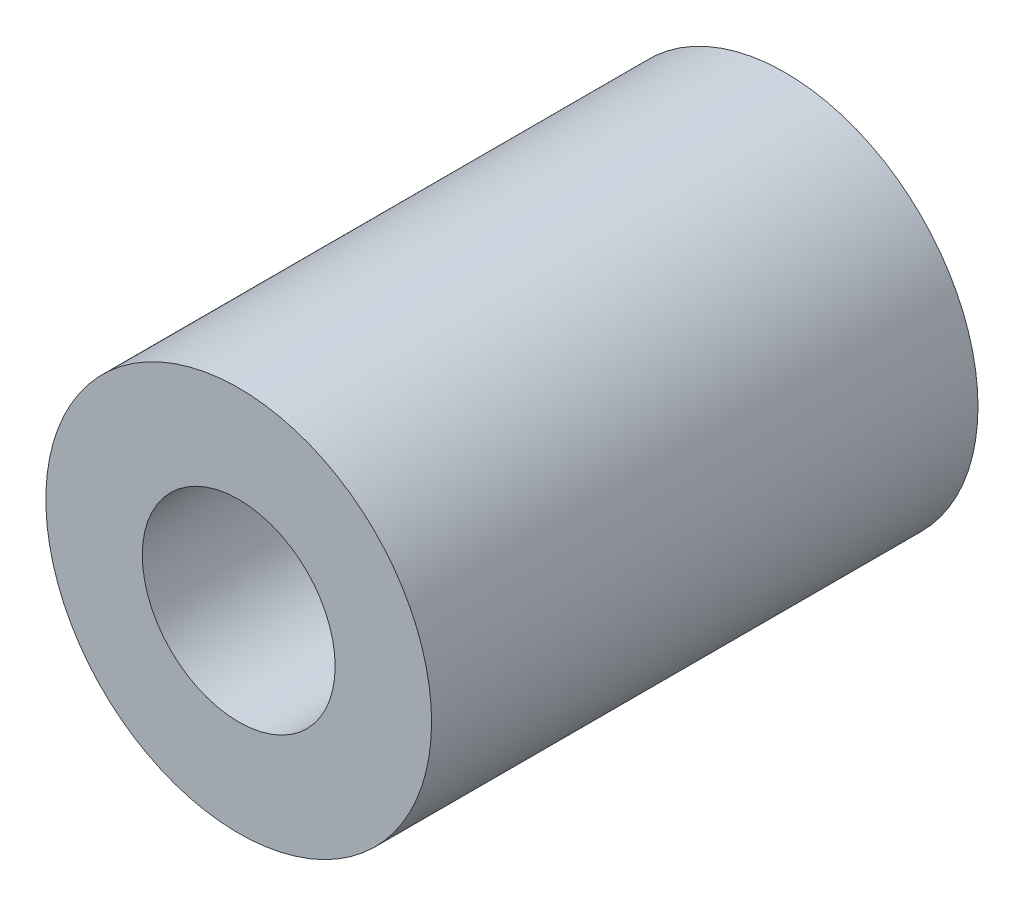
ISO-10303-21;
HEADER;
FILE_DESCRIPTION(('STEP AP214'),'2;1');
FILE_NAME('part.step','',(''),(''),'','','');
FILE_SCHEMA(('AUTOMOTIVE_DESIGN { 1 0 10303 214 1 1 1 1 }'));
ENDSEC;
DATA;
#1=APPLICATION_CONTEXT('core data for automotive mechanical design processes');
#2=APPLICATION_PROTOCOL_DEFINITION('international standard','automotive_design',2000,#1);
#3=PRODUCT_CONTEXT('',#1,'mechanical');
#4=PRODUCT('Part','Part','',(#3));
#5=PRODUCT_RELATED_PRODUCT_CATEGORY('part','',(#4));
#6=PRODUCT_DEFINITION_FORMATION('','',#4);
#7=PRODUCT_DEFINITION_CONTEXT('part definition',#1,'design');
#8=PRODUCT_DEFINITION('design','',#6,#7);
#9=PRODUCT_DEFINITION_SHAPE('','',#8);
#10=(LENGTH_UNIT() NAMED_UNIT(*) SI_UNIT(.MILLI.,.METRE.));
#11=(NAMED_UNIT(*) PLANE_ANGLE_UNIT() SI_UNIT($,.RADIAN.));
#12=(NAMED_UNIT(*) SI_UNIT($,.STERADIAN.) SOLID_ANGLE_UNIT());
#13=UNCERTAINTY_MEASURE_WITH_UNIT(LENGTH_MEASURE(1.E-05),#10,'distance_accuracy_value','');
#14=(GEOMETRIC_REPRESENTATION_CONTEXT(3) GLOBAL_UNCERTAINTY_ASSIGNED_CONTEXT((#13)) GLOBAL_UNIT_ASSIGNED_CONTEXT((#10,
#11,#12)) REPRESENTATION_CONTEXT('',''));
#15=CARTESIAN_POINT('',(0.,0.,0.));
#16=DIRECTION('',(0.,0.,1.));
#17=DIRECTION('',(1.,0.,0.));
#18=AXIS2_PLACEMENT_3D('',#15,#16,#17);
#19=CARTESIAN_POINT('',(0.,0.,17.));
#20=DIRECTION('',(0.,0.,1.));
#21=DIRECTION('',(1.,0.,0.));
#22=AXIS2_PLACEMENT_3D('',#19,#20,#21);
#23=PLANE('',#22);
#24=CARTESIAN_POINT('',(0.,0.,17.));
#25=DIRECTION('',(0.,0.,1.));
#26=DIRECTION('',(1.,0.,0.));
#27=AXIS2_PLACEMENT_3D('',#24,#25,#26);
#28=CIRCLE('',#27,6.);
#29=CARTESIAN_POINT('',(6.,0.,17.));
#30=VERTEX_POINT('',#29);
#31=EDGE_CURVE('E10',#30,#30,#28,.T.);
#32=ORIENTED_EDGE('',*,*,#31,.T.);
#33=EDGE_LOOP('',(#32));
#34=FACE_BOUND('',#33,.T.);
#35=CARTESIAN_POINT('',(0.,0.,17.));
#36=DIRECTION('',(0.,0.,1.));
#37=DIRECTION('',(1.,0.,0.));
#38=AXIS2_PLACEMENT_3D('',#35,#36,#37);
#39=CIRCLE('',#38,3.);
#40=CARTESIAN_POINT('',(3.,0.,17.));
#41=VERTEX_POINT('',#40);
#42=EDGE_CURVE('E41',#41,#41,#39,.T.);
#43=ORIENTED_EDGE('',*,*,#42,.F.);
#44=EDGE_LOOP('',(#43));
#45=FACE_BOUND('',#44,.T.);
#46=ADVANCED_FACE('F30',(#34,#45),#23,.T.);
#47=CARTESIAN_POINT('',(0.,0.,0.));
#48=DIRECTION('',(0.,0.,1.));
#49=DIRECTION('',(1.,0.,0.));
#50=AXIS2_PLACEMENT_3D('',#47,#48,#49);
#51=PLANE('',#50);
#52=CARTESIAN_POINT('',(0.,0.,0.));
#53=DIRECTION('',(0.,0.,1.));
#54=DIRECTION('',(1.,0.,0.));
#55=AXIS2_PLACEMENT_3D('',#52,#53,#54);
#56=CIRCLE('',#55,6.);
#57=CARTESIAN_POINT('',(6.,0.,0.));
#58=VERTEX_POINT('',#57);
#59=EDGE_CURVE('E34',#58,#58,#56,.T.);
#60=ORIENTED_EDGE('',*,*,#59,.F.);
#61=EDGE_LOOP('',(#60));
#62=FACE_BOUND('',#61,.T.);
#63=CARTESIAN_POINT('',(0.,0.,0.));
#64=DIRECTION('',(0.,0.,1.));
#65=DIRECTION('',(1.,0.,0.));
#66=AXIS2_PLACEMENT_3D('',#63,#64,#65);
#67=CIRCLE('',#66,3.);
#68=CARTESIAN_POINT('',(3.,0.,0.));
#69=VERTEX_POINT('',#68);
#70=EDGE_CURVE('E43',#69,#69,#67,.T.);
#71=ORIENTED_EDGE('',*,*,#70,.T.);
#72=EDGE_LOOP('',(#71));
#73=FACE_BOUND('',#72,.T.);
#74=ADVANCED_FACE('F53',(#62,#73),#51,.F.);
#75=CARTESIAN_POINT('',(0.,0.,17.));
#76=DIRECTION('',(0.,0.,-1.));
#77=DIRECTION('',(-1.,0.,0.));
#78=AXIS2_PLACEMENT_3D('',#75,#76,#77);
#79=CYLINDRICAL_SURFACE('',#78,6.);
#80=ORIENTED_EDGE('',*,*,#31,.F.);
#81=EDGE_LOOP('',(#80));
#82=FACE_BOUND('',#81,.T.);
#83=ORIENTED_EDGE('',*,*,#59,.T.);
#84=EDGE_LOOP('',(#83));
#85=FACE_BOUND('',#84,.T.);
#86=ADVANCED_FACE('F32',(#82,#85),#79,.T.);
#87=CARTESIAN_POINT('',(0.,0.,17.));
#88=DIRECTION('',(0.,0.,-1.));
#89=DIRECTION('',(-1.,0.,0.));
#90=AXIS2_PLACEMENT_3D('',#87,#88,#89);
#91=CYLINDRICAL_SURFACE('',#90,3.);
#92=ORIENTED_EDGE('',*,*,#42,.T.);
#93=EDGE_LOOP('',(#92));
#94=FACE_BOUND('',#93,.T.);
#95=ORIENTED_EDGE('',*,*,#70,.F.);
#96=EDGE_LOOP('',(#95));
#97=FACE_BOUND('',#96,.T.);
#98=ADVANCED_FACE('F49',(#94,#97),#91,.F.);
#99=CLOSED_SHELL('',(#46,#74,#86,#98));
#100=MANIFOLD_SOLID_BREP('B2',#99);
#101=ADVANCED_BREP_SHAPE_REPRESENTATION('',(#18,#100),#14);
#102=SHAPE_DEFINITION_REPRESENTATION(#9,#101);
ENDSEC;
END-ISO-10303-21;
